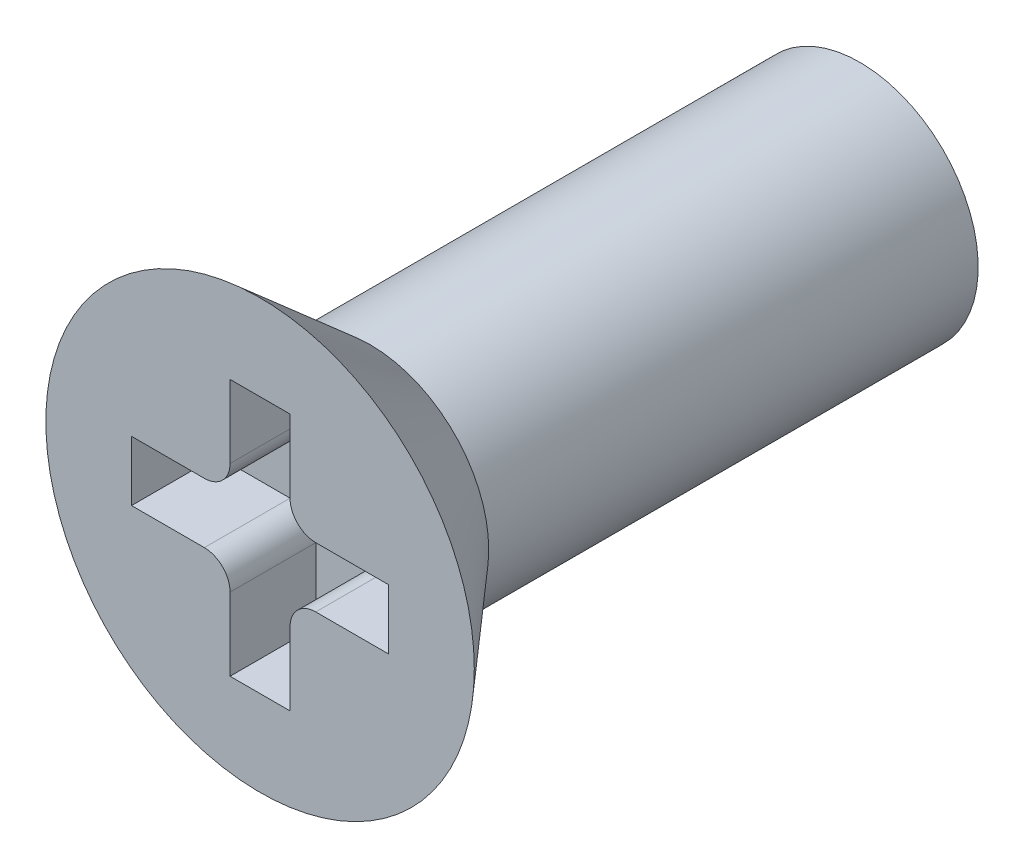
ISO-10303-21;
HEADER;
FILE_DESCRIPTION(('STEP AP214'),'2;1');
FILE_NAME('part.step','',(''),(''),'','','');
FILE_SCHEMA(('AUTOMOTIVE_DESIGN { 1 0 10303 214 1 1 1 1 }'));
ENDSEC;
DATA;
#1=APPLICATION_CONTEXT('core data for automotive mechanical design processes');
#2=APPLICATION_PROTOCOL_DEFINITION('international standard','automotive_design',2000,#1);
#3=PRODUCT_CONTEXT('',#1,'mechanical');
#4=PRODUCT('Part','Part','',(#3));
#5=PRODUCT_RELATED_PRODUCT_CATEGORY('part','',(#4));
#6=PRODUCT_DEFINITION_FORMATION('','',#4);
#7=PRODUCT_DEFINITION_CONTEXT('part definition',#1,'design');
#8=PRODUCT_DEFINITION('design','',#6,#7);
#9=PRODUCT_DEFINITION_SHAPE('','',#8);
#10=(LENGTH_UNIT() NAMED_UNIT(*) SI_UNIT(.MILLI.,.METRE.));
#11=(NAMED_UNIT(*) PLANE_ANGLE_UNIT() SI_UNIT($,.RADIAN.));
#12=(NAMED_UNIT(*) SI_UNIT($,.STERADIAN.) SOLID_ANGLE_UNIT());
#13=UNCERTAINTY_MEASURE_WITH_UNIT(LENGTH_MEASURE(1.E-05),#10,'distance_accuracy_value','');
#14=(GEOMETRIC_REPRESENTATION_CONTEXT(3) GLOBAL_UNCERTAINTY_ASSIGNED_CONTEXT((#13)) GLOBAL_UNIT_ASSIGNED_CONTEXT((#10,
#11,#12)) REPRESENTATION_CONTEXT('',''));
#15=CARTESIAN_POINT('',(0.,0.,0.));
#16=DIRECTION('',(0.,0.,1.));
#17=DIRECTION('',(1.,0.,0.));
#18=AXIS2_PLACEMENT_3D('',#15,#16,#17);
#19=CARTESIAN_POINT('',(-0.8255,-0.8255,7.62));
#20=DIRECTION('',(0.,0.,1.));
#21=DIRECTION('',(1.,0.,0.));
#22=AXIS2_PLACEMENT_3D('',#19,#20,#21);
#23=PLANE('',#22);
#24=DIRECTION('',(0.,1.,0.));
#25=VECTOR('',#24,1.);
#26=CARTESIAN_POINT('',(-1.905,-0.4445,7.62));
#27=LINE('',#26,#25);
#28=CARTESIAN_POINT('',(-1.905,-0.4445,7.62));
#29=VERTEX_POINT('',#28);
#30=CARTESIAN_POINT('',(-1.905,0.4445,7.62));
#31=VERTEX_POINT('',#30);
#32=EDGE_CURVE('E156',#29,#31,#27,.T.);
#33=ORIENTED_EDGE('',*,*,#32,.F.);
#34=DIRECTION('',(1.,0.,0.));
#35=VECTOR('',#34,1.);
#36=CARTESIAN_POINT('',(-0.8255,-0.4445,7.62));
#37=LINE('',#36,#35);
#38=CARTESIAN_POINT('',(-0.8255,-0.4445,7.62));
#39=VERTEX_POINT('',#38);
#40=EDGE_CURVE('E157',#39,#29,#37,.F.);
#41=ORIENTED_EDGE('',*,*,#40,.F.);
#42=CARTESIAN_POINT('',(-0.8255,-0.8255,7.62));
#43=DIRECTION('',(0.,0.,-1.));
#44=DIRECTION('',(-1.,0.,0.));
#45=AXIS2_PLACEMENT_3D('',#42,#43,#44);
#46=CIRCLE('',#45,0.381);
#47=CARTESIAN_POINT('',(-0.4445,-0.8255,7.62));
#48=VERTEX_POINT('',#47);
#49=EDGE_CURVE('E301',#48,#39,#46,.F.);
#50=ORIENTED_EDGE('',*,*,#49,.F.);
#51=DIRECTION('',(0.,1.,0.));
#52=VECTOR('',#51,1.);
#53=CARTESIAN_POINT('',(-0.4445,-1.905,7.62));
#54=LINE('',#53,#52);
#55=CARTESIAN_POINT('',(-0.4445,-1.905,7.62));
#56=VERTEX_POINT('',#55);
#57=EDGE_CURVE('E251',#56,#48,#54,.T.);
#58=ORIENTED_EDGE('',*,*,#57,.F.);
#59=DIRECTION('',(-1.,0.,0.));
#60=VECTOR('',#59,1.);
#61=CARTESIAN_POINT('',(0.4445,-1.905,7.62));
#62=LINE('',#61,#60);
#63=CARTESIAN_POINT('',(0.444500000000001,-1.905,7.62));
#64=VERTEX_POINT('',#63);
#65=EDGE_CURVE('E109',#64,#56,#62,.T.);
#66=ORIENTED_EDGE('',*,*,#65,.F.);
#67=DIRECTION('',(0.,-1.,0.));
#68=VECTOR('',#67,1.);
#69=CARTESIAN_POINT('',(0.4445,-0.8255,7.62));
#70=LINE('',#69,#68);
#71=CARTESIAN_POINT('',(0.4445,-0.8255,7.62));
#72=VERTEX_POINT('',#71);
#73=EDGE_CURVE('E105',#72,#64,#70,.T.);
#74=ORIENTED_EDGE('',*,*,#73,.F.);
#75=CARTESIAN_POINT('',(0.8255,-0.8255,7.62));
#76=DIRECTION('',(0.,0.,-1.));
#77=DIRECTION('',(-1.,0.,0.));
#78=AXIS2_PLACEMENT_3D('',#75,#76,#77);
#79=CIRCLE('',#78,0.381);
#80=CARTESIAN_POINT('',(0.8255,-0.444499999999999,7.62));
#81=VERTEX_POINT('',#80);
#82=EDGE_CURVE('E20',#81,#72,#79,.F.);
#83=ORIENTED_EDGE('',*,*,#82,.F.);
#84=DIRECTION('',(-1.,0.,0.));
#85=VECTOR('',#84,1.);
#86=CARTESIAN_POINT('',(1.905,-0.4445,7.62));
#87=LINE('',#86,#85);
#88=CARTESIAN_POINT('',(1.905,-0.4445,7.62));
#89=VERTEX_POINT('',#88);
#90=EDGE_CURVE('E226',#89,#81,#87,.T.);
#91=ORIENTED_EDGE('',*,*,#90,.F.);
#92=DIRECTION('',(0.,1.,0.));
#93=VECTOR('',#92,1.);
#94=CARTESIAN_POINT('',(1.905,0.4445,7.62));
#95=LINE('',#94,#93);
#96=CARTESIAN_POINT('',(1.905,0.4445,7.62));
#97=VERTEX_POINT('',#96);
#98=EDGE_CURVE('E220',#97,#89,#95,.F.);
#99=ORIENTED_EDGE('',*,*,#98,.F.);
#100=DIRECTION('',(1.,0.,0.));
#101=VECTOR('',#100,1.);
#102=CARTESIAN_POINT('',(0.8255,0.4445,7.62));
#103=LINE('',#102,#101);
#104=CARTESIAN_POINT('',(0.8255,0.4445,7.62));
#105=VERTEX_POINT('',#104);
#106=EDGE_CURVE('E208',#105,#97,#103,.T.);
#107=ORIENTED_EDGE('',*,*,#106,.F.);
#108=CARTESIAN_POINT('',(0.8255,0.8255,7.62));
#109=DIRECTION('',(0.,0.,-1.));
#110=DIRECTION('',(-1.,0.,0.));
#111=AXIS2_PLACEMENT_3D('',#108,#109,#110);
#112=CIRCLE('',#111,0.381);
#113=CARTESIAN_POINT('',(0.444499999999999,0.8255,7.62));
#114=VERTEX_POINT('',#113);
#115=EDGE_CURVE('E204',#114,#105,#112,.F.);
#116=ORIENTED_EDGE('',*,*,#115,.F.);
#117=DIRECTION('',(0.,-1.,0.));
#118=VECTOR('',#117,1.);
#119=CARTESIAN_POINT('',(0.4445,1.905,7.62));
#120=LINE('',#119,#118);
#121=CARTESIAN_POINT('',(0.4445,1.905,7.62));
#122=VERTEX_POINT('',#121);
#123=EDGE_CURVE('E200',#122,#114,#120,.T.);
#124=ORIENTED_EDGE('',*,*,#123,.F.);
#125=DIRECTION('',(1.,0.,0.));
#126=VECTOR('',#125,1.);
#127=CARTESIAN_POINT('',(-0.4445,1.905,7.62));
#128=LINE('',#127,#126);
#129=CARTESIAN_POINT('',(-0.444500000000001,1.905,7.62));
#130=VERTEX_POINT('',#129);
#131=EDGE_CURVE('E194',#130,#122,#128,.T.);
#132=ORIENTED_EDGE('',*,*,#131,.F.);
#133=DIRECTION('',(0.,1.,0.));
#134=VECTOR('',#133,1.);
#135=CARTESIAN_POINT('',(-0.4445,0.8255,7.62));
#136=LINE('',#135,#134);
#137=CARTESIAN_POINT('',(-0.4445,0.8255,7.62));
#138=VERTEX_POINT('',#137);
#139=EDGE_CURVE('E182',#138,#130,#136,.T.);
#140=ORIENTED_EDGE('',*,*,#139,.F.);
#141=CARTESIAN_POINT('',(-0.8255,0.8255,7.62));
#142=DIRECTION('',(0.,0.,-1.));
#143=DIRECTION('',(-1.,0.,0.));
#144=AXIS2_PLACEMENT_3D('',#141,#142,#143);
#145=CIRCLE('',#144,0.381);
#146=CARTESIAN_POINT('',(-0.8255,0.444499999999999,7.62));
#147=VERTEX_POINT('',#146);
#148=EDGE_CURVE('E178',#147,#138,#145,.F.);
#149=ORIENTED_EDGE('',*,*,#148,.F.);
#150=DIRECTION('',(1.,0.,0.));
#151=VECTOR('',#150,1.);
#152=CARTESIAN_POINT('',(-1.905,0.4445,7.62));
#153=LINE('',#152,#151);
#154=EDGE_CURVE('E174',#31,#147,#153,.T.);
#155=ORIENTED_EDGE('',*,*,#154,.F.);
#156=EDGE_LOOP('',(#33,#41,#50,#58,#66,#74,#83,#91,#99,#107,#116,#124,#132,#140,#149,#155));
#157=FACE_BOUND('',#156,.T.);
#158=ADVANCED_FACE('F17',(#157),#23,.T.);
#159=CARTESIAN_POINT('',(-0.4445,-1.905,7.62));
#160=DIRECTION('',(1.,0.,0.));
#161=DIRECTION('',(0.,1.,0.));
#162=AXIS2_PLACEMENT_3D('',#159,#160,#161);
#163=PLANE('',#162);
#164=ORIENTED_EDGE('',*,*,#57,.T.);
#165=DIRECTION('',(0.,0.,-1.));
#166=VECTOR('',#165,1.);
#167=CARTESIAN_POINT('',(-0.4445,-0.8255,7.62));
#168=LINE('',#167,#166);
#169=CARTESIAN_POINT('',(-0.4445,-0.8255,8.89));
#170=VERTEX_POINT('',#169);
#171=EDGE_CURVE('E305',#170,#48,#168,.T.);
#172=ORIENTED_EDGE('',*,*,#171,.F.);
#173=DIRECTION('',(0.,1.,0.));
#174=VECTOR('',#173,1.);
#175=CARTESIAN_POINT('',(-0.4445,0.,8.89));
#176=LINE('',#175,#174);
#177=CARTESIAN_POINT('',(-0.4445,-1.905,8.89));
#178=VERTEX_POINT('',#177);
#179=EDGE_CURVE('E238',#170,#178,#176,.F.);
#180=ORIENTED_EDGE('',*,*,#179,.T.);
#181=DIRECTION('',(0.,0.,1.));
#182=VECTOR('',#181,1.);
#183=CARTESIAN_POINT('',(-0.4445,-1.905,7.62));
#184=LINE('',#183,#182);
#185=EDGE_CURVE('E241',#56,#178,#184,.T.);
#186=ORIENTED_EDGE('',*,*,#185,.F.);
#187=EDGE_LOOP('',(#164,#172,#180,#186));
#188=FACE_BOUND('',#187,.T.);
#189=ADVANCED_FACE('F525',(#188),#163,.T.);
#190=CARTESIAN_POINT('',(0.4445,-1.905,7.62));
#191=DIRECTION('',(0.,1.,0.));
#192=DIRECTION('',(-1.,0.,0.));
#193=AXIS2_PLACEMENT_3D('',#190,#191,#192);
#194=PLANE('',#193);
#195=ORIENTED_EDGE('',*,*,#65,.T.);
#196=ORIENTED_EDGE('',*,*,#185,.T.);
#197=DIRECTION('',(-1.,0.,0.));
#198=VECTOR('',#197,1.);
#199=CARTESIAN_POINT('',(3.175,-1.905,8.89));
#200=LINE('',#199,#198);
#201=CARTESIAN_POINT('',(0.4445,-1.905,8.89));
#202=VERTEX_POINT('',#201);
#203=EDGE_CURVE('E235',#178,#202,#200,.F.);
#204=ORIENTED_EDGE('',*,*,#203,.T.);
#205=DIRECTION('',(0.,0.,1.));
#206=VECTOR('',#205,1.);
#207=CARTESIAN_POINT('',(0.444500000000001,-1.905,7.62));
#208=LINE('',#207,#206);
#209=EDGE_CURVE('E230',#64,#202,#208,.T.);
#210=ORIENTED_EDGE('',*,*,#209,.F.);
#211=EDGE_LOOP('',(#195,#196,#204,#210));
#212=FACE_BOUND('',#211,.T.);
#213=ADVANCED_FACE('F516',(#212),#194,.T.);
#214=CARTESIAN_POINT('',(0.4445,-0.8255,7.62));
#215=DIRECTION('',(-1.,0.,0.));
#216=DIRECTION('',(0.,-1.,0.));
#217=AXIS2_PLACEMENT_3D('',#214,#215,#216);
#218=PLANE('',#217);
#219=ORIENTED_EDGE('',*,*,#73,.T.);
#220=ORIENTED_EDGE('',*,*,#209,.T.);
#221=DIRECTION('',(0.,1.,0.));
#222=VECTOR('',#221,1.);
#223=CARTESIAN_POINT('',(0.4445,0.,8.89));
#224=LINE('',#223,#222);
#225=CARTESIAN_POINT('',(0.4445,-0.8255,8.89));
#226=VERTEX_POINT('',#225);
#227=EDGE_CURVE('E237',#202,#226,#224,.T.);
#228=ORIENTED_EDGE('',*,*,#227,.T.);
#229=DIRECTION('',(0.,0.,-1.));
#230=VECTOR('',#229,1.);
#231=CARTESIAN_POINT('',(0.4445,-0.8255,7.62));
#232=LINE('',#231,#230);
#233=EDGE_CURVE('E227',#72,#226,#232,.F.);
#234=ORIENTED_EDGE('',*,*,#233,.F.);
#235=EDGE_LOOP('',(#219,#220,#228,#234));
#236=FACE_BOUND('',#235,.T.);
#237=ADVANCED_FACE('F507',(#236),#218,.T.);
#238=CARTESIAN_POINT('',(0.8255,-0.8255,7.62));
#239=DIRECTION('',(0.,0.,-1.));
#240=DIRECTION('',(-1.,0.,0.));
#241=AXIS2_PLACEMENT_3D('',#238,#239,#240);
#242=CYLINDRICAL_SURFACE('',#241,0.381);
#243=ORIENTED_EDGE('',*,*,#82,.T.);
#244=ORIENTED_EDGE('',*,*,#233,.T.);
#245=CARTESIAN_POINT('',(0.8255,-0.8255,8.89));
#246=DIRECTION('',(0.,0.,-1.));
#247=DIRECTION('',(-1.,0.,0.));
#248=AXIS2_PLACEMENT_3D('',#245,#246,#247);
#249=CIRCLE('',#248,0.381);
#250=CARTESIAN_POINT('',(0.8255,-0.4445,8.89));
#251=VERTEX_POINT('',#250);
#252=EDGE_CURVE('E299',#226,#251,#249,.T.);
#253=ORIENTED_EDGE('',*,*,#252,.T.);
#254=DIRECTION('',(0.,0.,1.));
#255=VECTOR('',#254,1.);
#256=CARTESIAN_POINT('',(0.8255,-0.444499999999999,7.62));
#257=LINE('',#256,#255);
#258=EDGE_CURVE('E223',#81,#251,#257,.T.);
#259=ORIENTED_EDGE('',*,*,#258,.F.);
#260=EDGE_LOOP('',(#243,#244,#253,#259));
#261=FACE_BOUND('',#260,.T.);
#262=ADVANCED_FACE('F498',(#261),#242,.T.);
#263=CARTESIAN_POINT('',(1.905,-0.4445,7.62));
#264=DIRECTION('',(0.,1.,0.));
#265=DIRECTION('',(-1.,0.,0.));
#266=AXIS2_PLACEMENT_3D('',#263,#264,#265);
#267=PLANE('',#266);
#268=ORIENTED_EDGE('',*,*,#90,.T.);
#269=ORIENTED_EDGE('',*,*,#258,.T.);
#270=DIRECTION('',(-1.,0.,0.));
#271=VECTOR('',#270,1.);
#272=CARTESIAN_POINT('',(3.175,-0.4445,8.89));
#273=LINE('',#272,#271);
#274=CARTESIAN_POINT('',(1.905,-0.4445,8.89));
#275=VERTEX_POINT('',#274);
#276=EDGE_CURVE('E214',#251,#275,#273,.F.);
#277=ORIENTED_EDGE('',*,*,#276,.T.);
#278=DIRECTION('',(0.,0.,1.));
#279=VECTOR('',#278,1.);
#280=CARTESIAN_POINT('',(1.905,-0.4445,7.62));
#281=LINE('',#280,#279);
#282=EDGE_CURVE('E217',#89,#275,#281,.T.);
#283=ORIENTED_EDGE('',*,*,#282,.F.);
#284=EDGE_LOOP('',(#268,#269,#277,#283));
#285=FACE_BOUND('',#284,.T.);
#286=ADVANCED_FACE('F489',(#285),#267,.T.);
#287=CARTESIAN_POINT('',(1.905,0.4445,7.62));
#288=DIRECTION('',(-1.,0.,0.));
#289=DIRECTION('',(0.,0.,1.));
#290=AXIS2_PLACEMENT_3D('',#287,#288,#289);
#291=PLANE('',#290);
#292=ORIENTED_EDGE('',*,*,#98,.T.);
#293=ORIENTED_EDGE('',*,*,#282,.T.);
#294=DIRECTION('',(0.,1.,0.));
#295=VECTOR('',#294,1.);
#296=CARTESIAN_POINT('',(1.905,0.,8.89));
#297=LINE('',#296,#295);
#298=CARTESIAN_POINT('',(1.905,0.4445,8.89));
#299=VERTEX_POINT('',#298);
#300=EDGE_CURVE('E211',#275,#299,#297,.T.);
#301=ORIENTED_EDGE('',*,*,#300,.T.);
#302=DIRECTION('',(0.,0.,1.));
#303=VECTOR('',#302,1.);
#304=CARTESIAN_POINT('',(1.905,0.4445,7.62));
#305=LINE('',#304,#303);
#306=EDGE_CURVE('E205',#97,#299,#305,.T.);
#307=ORIENTED_EDGE('',*,*,#306,.F.);
#308=EDGE_LOOP('',(#292,#293,#301,#307));
#309=FACE_BOUND('',#308,.T.);
#310=ADVANCED_FACE('F481',(#309),#291,.T.);
#311=CARTESIAN_POINT('',(0.8255,0.4445,7.62));
#312=DIRECTION('',(0.,-1.,0.));
#313=DIRECTION('',(1.,0.,0.));
#314=AXIS2_PLACEMENT_3D('',#311,#312,#313);
#315=PLANE('',#314);
#316=ORIENTED_EDGE('',*,*,#106,.T.);
#317=ORIENTED_EDGE('',*,*,#306,.T.);
#318=DIRECTION('',(-1.,0.,0.));
#319=VECTOR('',#318,1.);
#320=CARTESIAN_POINT('',(3.175,0.4445,8.89));
#321=LINE('',#320,#319);
#322=CARTESIAN_POINT('',(0.825500000000001,0.4445,8.89));
#323=VERTEX_POINT('',#322);
#324=EDGE_CURVE('E213',#299,#323,#321,.T.);
#325=ORIENTED_EDGE('',*,*,#324,.T.);
#326=DIRECTION('',(0.,0.,-1.));
#327=VECTOR('',#326,1.);
#328=CARTESIAN_POINT('',(0.8255,0.4445,7.62));
#329=LINE('',#328,#327);
#330=EDGE_CURVE('E201',#105,#323,#329,.F.);
#331=ORIENTED_EDGE('',*,*,#330,.F.);
#332=EDGE_LOOP('',(#316,#317,#325,#331));
#333=FACE_BOUND('',#332,.T.);
#334=ADVANCED_FACE('F316',(#333),#315,.T.);
#335=CARTESIAN_POINT('',(0.8255,0.8255,7.62));
#336=DIRECTION('',(0.,0.,-1.));
#337=DIRECTION('',(-1.,0.,0.));
#338=AXIS2_PLACEMENT_3D('',#335,#336,#337);
#339=CYLINDRICAL_SURFACE('',#338,0.381);
#340=ORIENTED_EDGE('',*,*,#115,.T.);
#341=ORIENTED_EDGE('',*,*,#330,.T.);
#342=CARTESIAN_POINT('',(0.8255,0.8255,8.89));
#343=DIRECTION('',(0.,0.,-1.));
#344=DIRECTION('',(-1.,0.,0.));
#345=AXIS2_PLACEMENT_3D('',#342,#343,#344);
#346=CIRCLE('',#345,0.381);
#347=CARTESIAN_POINT('',(0.444499999999999,0.8255,8.89));
#348=VERTEX_POINT('',#347);
#349=EDGE_CURVE('E297',#323,#348,#346,.T.);
#350=ORIENTED_EDGE('',*,*,#349,.T.);
#351=DIRECTION('',(0.,0.,1.));
#352=VECTOR('',#351,1.);
#353=CARTESIAN_POINT('',(0.444499999999999,0.8255,7.62));
#354=LINE('',#353,#352);
#355=EDGE_CURVE('E197',#114,#348,#354,.T.);
#356=ORIENTED_EDGE('',*,*,#355,.F.);
#357=EDGE_LOOP('',(#340,#341,#350,#356));
#358=FACE_BOUND('',#357,.T.);
#359=ADVANCED_FACE('F310',(#358),#339,.T.);
#360=CARTESIAN_POINT('',(0.4445,1.905,7.62));
#361=DIRECTION('',(-1.,0.,0.));
#362=DIRECTION('',(0.,-1.,0.));
#363=AXIS2_PLACEMENT_3D('',#360,#361,#362);
#364=PLANE('',#363);
#365=ORIENTED_EDGE('',*,*,#123,.T.);
#366=ORIENTED_EDGE('',*,*,#355,.T.);
#367=DIRECTION('',(0.,1.,0.));
#368=VECTOR('',#367,1.);
#369=CARTESIAN_POINT('',(0.4445,0.,8.89));
#370=LINE('',#369,#368);
#371=CARTESIAN_POINT('',(0.4445,1.905,8.89));
#372=VERTEX_POINT('',#371);
#373=EDGE_CURVE('E188',#348,#372,#370,.T.);
#374=ORIENTED_EDGE('',*,*,#373,.T.);
#375=DIRECTION('',(0.,0.,1.));
#376=VECTOR('',#375,1.);
#377=CARTESIAN_POINT('',(0.4445,1.905,7.62));
#378=LINE('',#377,#376);
#379=EDGE_CURVE('E191',#122,#372,#378,.T.);
#380=ORIENTED_EDGE('',*,*,#379,.F.);
#381=EDGE_LOOP('',(#365,#366,#374,#380));
#382=FACE_BOUND('',#381,.T.);
#383=ADVANCED_FACE('F352',(#382),#364,.T.);
#384=CARTESIAN_POINT('',(-0.4445,1.905,7.62));
#385=DIRECTION('',(0.,-1.,0.));
#386=DIRECTION('',(1.,0.,0.));
#387=AXIS2_PLACEMENT_3D('',#384,#385,#386);
#388=PLANE('',#387);
#389=ORIENTED_EDGE('',*,*,#131,.T.);
#390=ORIENTED_EDGE('',*,*,#379,.T.);
#391=DIRECTION('',(-1.,0.,0.));
#392=VECTOR('',#391,1.);
#393=CARTESIAN_POINT('',(3.175,1.905,8.89));
#394=LINE('',#393,#392);
#395=CARTESIAN_POINT('',(-0.4445,1.905,8.89));
#396=VERTEX_POINT('',#395);
#397=EDGE_CURVE('E185',#372,#396,#394,.T.);
#398=ORIENTED_EDGE('',*,*,#397,.T.);
#399=DIRECTION('',(0.,0.,1.));
#400=VECTOR('',#399,1.);
#401=CARTESIAN_POINT('',(-0.444500000000001,1.905,7.62));
#402=LINE('',#401,#400);
#403=EDGE_CURVE('E179',#130,#396,#402,.T.);
#404=ORIENTED_EDGE('',*,*,#403,.F.);
#405=EDGE_LOOP('',(#389,#390,#398,#404));
#406=FACE_BOUND('',#405,.T.);
#407=ADVANCED_FACE('F354',(#406),#388,.T.);
#408=CARTESIAN_POINT('',(-0.4445,0.8255,7.62));
#409=DIRECTION('',(1.,0.,0.));
#410=DIRECTION('',(0.,1.,0.));
#411=AXIS2_PLACEMENT_3D('',#408,#409,#410);
#412=PLANE('',#411);
#413=ORIENTED_EDGE('',*,*,#139,.T.);
#414=ORIENTED_EDGE('',*,*,#403,.T.);
#415=DIRECTION('',(0.,1.,0.));
#416=VECTOR('',#415,1.);
#417=CARTESIAN_POINT('',(-0.4445,0.,8.89));
#418=LINE('',#417,#416);
#419=CARTESIAN_POINT('',(-0.4445,0.8255,8.89));
#420=VERTEX_POINT('',#419);
#421=EDGE_CURVE('E187',#396,#420,#418,.F.);
#422=ORIENTED_EDGE('',*,*,#421,.T.);
#423=DIRECTION('',(0.,0.,-1.));
#424=VECTOR('',#423,1.);
#425=CARTESIAN_POINT('',(-0.4445,0.8255,7.62));
#426=LINE('',#425,#424);
#427=EDGE_CURVE('E175',#138,#420,#426,.F.);
#428=ORIENTED_EDGE('',*,*,#427,.F.);
#429=EDGE_LOOP('',(#413,#414,#422,#428));
#430=FACE_BOUND('',#429,.T.);
#431=ADVANCED_FACE('F356',(#430),#412,.T.);
#432=CARTESIAN_POINT('',(-0.8255,0.8255,7.62));
#433=DIRECTION('',(0.,0.,-1.));
#434=DIRECTION('',(-1.,0.,0.));
#435=AXIS2_PLACEMENT_3D('',#432,#433,#434);
#436=CYLINDRICAL_SURFACE('',#435,0.381);
#437=ORIENTED_EDGE('',*,*,#148,.T.);
#438=ORIENTED_EDGE('',*,*,#427,.T.);
#439=CARTESIAN_POINT('',(-0.8255,0.8255,8.89));
#440=DIRECTION('',(0.,0.,-1.));
#441=DIRECTION('',(-1.,0.,0.));
#442=AXIS2_PLACEMENT_3D('',#439,#440,#441);
#443=CIRCLE('',#442,0.381);
#444=CARTESIAN_POINT('',(-0.8255,0.4445,8.89));
#445=VERTEX_POINT('',#444);
#446=EDGE_CURVE('E151',#420,#445,#443,.T.);
#447=ORIENTED_EDGE('',*,*,#446,.T.);
#448=DIRECTION('',(0.,0.,1.));
#449=VECTOR('',#448,1.);
#450=CARTESIAN_POINT('',(-0.8255,0.444499999999999,7.62));
#451=LINE('',#450,#449);
#452=EDGE_CURVE('E146',#147,#445,#451,.T.);
#453=ORIENTED_EDGE('',*,*,#452,.F.);
#454=EDGE_LOOP('',(#437,#438,#447,#453));
#455=FACE_BOUND('',#454,.T.);
#456=ADVANCED_FACE('F341',(#455),#436,.T.);
#457=CARTESIAN_POINT('',(-1.905,0.4445,7.62));
#458=DIRECTION('',(0.,-1.,0.));
#459=DIRECTION('',(1.,0.,0.));
#460=AXIS2_PLACEMENT_3D('',#457,#458,#459);
#461=PLANE('',#460);
#462=ORIENTED_EDGE('',*,*,#154,.T.);
#463=ORIENTED_EDGE('',*,*,#452,.T.);
#464=DIRECTION('',(-1.,0.,0.));
#465=VECTOR('',#464,1.);
#466=CARTESIAN_POINT('',(3.175,0.4445,8.89));
#467=LINE('',#466,#465);
#468=CARTESIAN_POINT('',(-1.905,0.4445,8.89));
#469=VERTEX_POINT('',#468);
#470=EDGE_CURVE('E139',#445,#469,#467,.T.);
#471=ORIENTED_EDGE('',*,*,#470,.T.);
#472=DIRECTION('',(0.,0.,-1.));
#473=VECTOR('',#472,1.);
#474=CARTESIAN_POINT('',(-1.905,0.4445,7.62));
#475=LINE('',#474,#473);
#476=EDGE_CURVE('E143',#31,#469,#475,.F.);
#477=ORIENTED_EDGE('',*,*,#476,.F.);
#478=EDGE_LOOP('',(#462,#463,#471,#477));
#479=FACE_BOUND('',#478,.T.);
#480=ADVANCED_FACE('F142',(#479),#461,.T.);
#481=CARTESIAN_POINT('',(-1.905,-0.4445,7.62));
#482=DIRECTION('',(1.,0.,0.));
#483=DIRECTION('',(0.,0.,-1.));
#484=AXIS2_PLACEMENT_3D('',#481,#482,#483);
#485=PLANE('',#484);
#486=ORIENTED_EDGE('',*,*,#32,.T.);
#487=ORIENTED_EDGE('',*,*,#476,.T.);
#488=DIRECTION('',(0.,1.,0.));
#489=VECTOR('',#488,1.);
#490=CARTESIAN_POINT('',(-1.905,0.,8.89));
#491=LINE('',#490,#489);
#492=CARTESIAN_POINT('',(-1.905,-0.4445,8.89));
#493=VERTEX_POINT('',#492);
#494=EDGE_CURVE('E150',#469,#493,#491,.F.);
#495=ORIENTED_EDGE('',*,*,#494,.T.);
#496=DIRECTION('',(0.,0.,1.));
#497=VECTOR('',#496,1.);
#498=CARTESIAN_POINT('',(-1.905,-0.4445,7.62));
#499=LINE('',#498,#497);
#500=EDGE_CURVE('E248',#29,#493,#499,.T.);
#501=ORIENTED_EDGE('',*,*,#500,.F.);
#502=EDGE_LOOP('',(#486,#487,#495,#501));
#503=FACE_BOUND('',#502,.T.);
#504=ADVANCED_FACE('F154',(#503),#485,.T.);
#505=CARTESIAN_POINT('',(-0.8255,-0.4445,7.62));
#506=DIRECTION('',(0.,1.,0.));
#507=DIRECTION('',(0.,0.,1.));
#508=AXIS2_PLACEMENT_3D('',#505,#506,#507);
#509=PLANE('',#508);
#510=ORIENTED_EDGE('',*,*,#40,.T.);
#511=ORIENTED_EDGE('',*,*,#500,.T.);
#512=DIRECTION('',(-1.,0.,0.));
#513=VECTOR('',#512,1.);
#514=CARTESIAN_POINT('',(3.175,-0.4445,8.89));
#515=LINE('',#514,#513);
#516=CARTESIAN_POINT('',(-0.825499999999999,-0.4445,8.89));
#517=VERTEX_POINT('',#516);
#518=EDGE_CURVE('E35',#493,#517,#515,.F.);
#519=ORIENTED_EDGE('',*,*,#518,.T.);
#520=DIRECTION('',(0.,0.,-1.));
#521=VECTOR('',#520,1.);
#522=CARTESIAN_POINT('',(-0.8255,-0.4445,7.62));
#523=LINE('',#522,#521);
#524=EDGE_CURVE('E304',#39,#517,#523,.F.);
#525=ORIENTED_EDGE('',*,*,#524,.F.);
#526=EDGE_LOOP('',(#510,#511,#519,#525));
#527=FACE_BOUND('',#526,.T.);
#528=ADVANCED_FACE('F337',(#527),#509,.T.);
#529=CARTESIAN_POINT('',(-0.8255,-0.8255,7.62));
#530=DIRECTION('',(0.,0.,-1.));
#531=DIRECTION('',(-1.,0.,0.));
#532=AXIS2_PLACEMENT_3D('',#529,#530,#531);
#533=CYLINDRICAL_SURFACE('',#532,0.381);
#534=ORIENTED_EDGE('',*,*,#49,.T.);
#535=ORIENTED_EDGE('',*,*,#524,.T.);
#536=CARTESIAN_POINT('',(-0.8255,-0.8255,8.89));
#537=DIRECTION('',(0.,0.,-1.));
#538=DIRECTION('',(-1.,0.,0.));
#539=AXIS2_PLACEMENT_3D('',#536,#537,#538);
#540=CIRCLE('',#539,0.381);
#541=EDGE_CURVE('E163',#517,#170,#540,.T.);
#542=ORIENTED_EDGE('',*,*,#541,.T.);
#543=ORIENTED_EDGE('',*,*,#171,.T.);
#544=EDGE_LOOP('',(#534,#535,#542,#543));
#545=FACE_BOUND('',#544,.T.);
#546=ADVANCED_FACE('F384',(#545),#533,.T.);
#547=CARTESIAN_POINT('',(3.175,0.,8.89));
#548=DIRECTION('',(0.,0.,-1.));
#549=DIRECTION('',(-1.,0.,0.));
#550=AXIS2_PLACEMENT_3D('',#547,#548,#549);
#551=PLANE('',#550);
#552=ORIENTED_EDGE('',*,*,#518,.F.);
#553=ORIENTED_EDGE('',*,*,#494,.F.);
#554=ORIENTED_EDGE('',*,*,#470,.F.);
#555=ORIENTED_EDGE('',*,*,#446,.F.);
#556=ORIENTED_EDGE('',*,*,#421,.F.);
#557=ORIENTED_EDGE('',*,*,#397,.F.);
#558=ORIENTED_EDGE('',*,*,#373,.F.);
#559=ORIENTED_EDGE('',*,*,#349,.F.);
#560=ORIENTED_EDGE('',*,*,#324,.F.);
#561=ORIENTED_EDGE('',*,*,#300,.F.);
#562=ORIENTED_EDGE('',*,*,#276,.F.);
#563=ORIENTED_EDGE('',*,*,#252,.F.);
#564=ORIENTED_EDGE('',*,*,#227,.F.);
#565=ORIENTED_EDGE('',*,*,#203,.F.);
#566=ORIENTED_EDGE('',*,*,#179,.F.);
#567=ORIENTED_EDGE('',*,*,#541,.F.);
#568=EDGE_LOOP('',(#552,#553,#554,#555,#556,#557,#558,#559,#560,#561,#562,#563,#564,#565,#566,#567));
#569=FACE_BOUND('',#568,.T.);
#570=CARTESIAN_POINT('',(0.,0.,8.8900000000649));
#571=DIRECTION('',(0.,0.,1.));
#572=DIRECTION('',(1.,0.,0.));
#573=AXIS2_PLACEMENT_3D('',#570,#571,#572);
#574=CIRCLE('',#573,3.17500000003337);
#575=CARTESIAN_POINT('',(3.17500000003337,0.,8.8900000000649));
#576=VERTEX_POINT('',#575);
#577=EDGE_CURVE('E291',#576,#576,#574,.F.);
#578=ORIENTED_EDGE('',*,*,#577,.F.);
#579=EDGE_LOOP('',(#578));
#580=FACE_BOUND('',#579,.T.);
#581=ADVANCED_FACE('F159',(#569,#580),#551,.F.);
#582=CARTESIAN_POINT('',(0.,0.,8.88999999989437));
#583=DIRECTION('',(0.,0.,1.));
#584=DIRECTION('',(1.,0.,0.));
#585=AXIS2_PLACEMENT_3D('',#582,#583,#584);
#586=CONICAL_SURFACE('',#585,3.17499999988513,0.715584993315978);
#587=CARTESIAN_POINT('',(0.,0.,7.25371597756883));
#588=DIRECTION('',(0.,0.,-1.));
#589=DIRECTION('',(-1.,0.,0.));
#590=AXIS2_PLACEMENT_3D('',#587,#588,#589);
#591=CIRCLE('',#590,1.7526);
#592=CARTESIAN_POINT('',(-1.7526,0.,7.25371597756883));
#593=VERTEX_POINT('',#592);
#594=EDGE_CURVE('E26',#593,#593,#591,.T.);
#595=ORIENTED_EDGE('',*,*,#594,.F.);
#596=EDGE_LOOP('',(#595));
#597=FACE_BOUND('',#596,.T.);
#598=ORIENTED_EDGE('',*,*,#577,.T.);
#599=EDGE_LOOP('',(#598));
#600=FACE_BOUND('',#599,.T.);
#601=ADVANCED_FACE('F374',(#597,#600),#586,.T.);
#602=CARTESIAN_POINT('',(0.,0.,0.));
#603=DIRECTION('',(0.,0.,1.));
#604=DIRECTION('',(1.,0.,0.));
#605=AXIS2_PLACEMENT_3D('',#602,#603,#604);
#606=PLANE('',#605);
#607=CARTESIAN_POINT('',(0.,0.,0.));
#608=DIRECTION('',(0.,0.,-1.));
#609=DIRECTION('',(-1.,0.,0.));
#610=AXIS2_PLACEMENT_3D('',#607,#608,#609);
#611=CIRCLE('',#610,1.7526);
#612=CARTESIAN_POINT('',(-1.7526,0.,0.));
#613=VERTEX_POINT('',#612);
#614=EDGE_CURVE('E11',#613,#613,#611,.F.);
#615=ORIENTED_EDGE('',*,*,#614,.F.);
#616=EDGE_LOOP('',(#615));
#617=FACE_BOUND('',#616,.T.);
#618=ADVANCED_FACE('F368',(#617),#606,.F.);
#619=CARTESIAN_POINT('',(0.,0.,8.89));
#620=DIRECTION('',(0.,0.,-1.));
#621=DIRECTION('',(-1.,0.,0.));
#622=AXIS2_PLACEMENT_3D('',#619,#620,#621);
#623=CYLINDRICAL_SURFACE('',#622,1.7526);
#624=ORIENTED_EDGE('',*,*,#614,.T.);
#625=EDGE_LOOP('',(#624));
#626=FACE_BOUND('',#625,.T.);
#627=ORIENTED_EDGE('',*,*,#594,.T.);
#628=EDGE_LOOP('',(#627));
#629=FACE_BOUND('',#628,.T.);
#630=ADVANCED_FACE('F366',(#626,#629),#623,.T.);
#631=CLOSED_SHELL('',(#158,#189,#213,#237,#262,#286,#310,#334,#359,#383,#407,#431,#456,#480,
#504,#528,#546,#581,#601,#618,#630));
#632=MANIFOLD_SOLID_BREP('B1',#631);
#633=ADVANCED_BREP_SHAPE_REPRESENTATION('',(#18,#632),#14);
#634=SHAPE_DEFINITION_REPRESENTATION(#9,#633);
ENDSEC;
END-ISO-10303-21;
